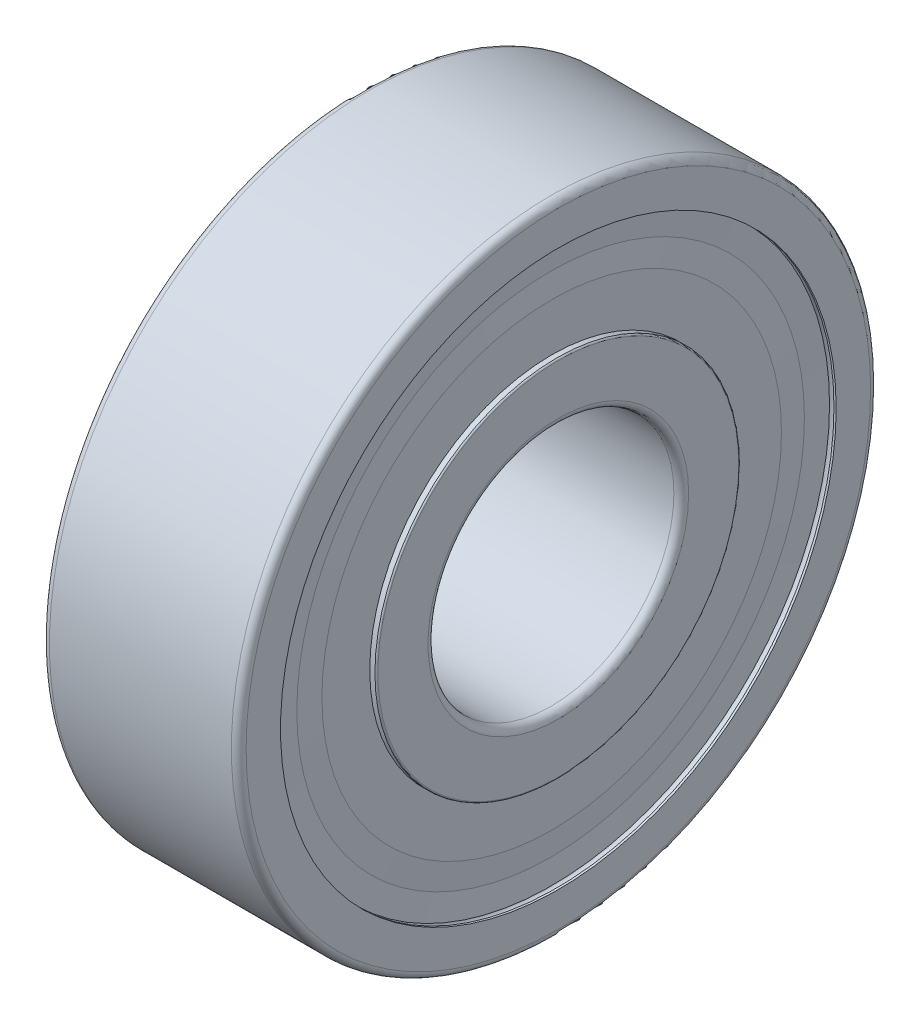
ISO-10303-21;
HEADER;
FILE_DESCRIPTION(('STEP AP214'),'2;1');
FILE_NAME('part.step','',(''),(''),'','','');
FILE_SCHEMA(('AUTOMOTIVE_DESIGN { 1 0 10303 214 1 1 1 1 }'));
ENDSEC;
DATA;
#1=APPLICATION_CONTEXT('core data for automotive mechanical design processes');
#2=APPLICATION_PROTOCOL_DEFINITION('international standard','automotive_design',2000,#1);
#3=PRODUCT_CONTEXT('',#1,'mechanical');
#4=PRODUCT('Part','Part','',(#3));
#5=PRODUCT_RELATED_PRODUCT_CATEGORY('part','',(#4));
#6=PRODUCT_DEFINITION_FORMATION('','',#4);
#7=PRODUCT_DEFINITION_CONTEXT('part definition',#1,'design');
#8=PRODUCT_DEFINITION('design','',#6,#7);
#9=PRODUCT_DEFINITION_SHAPE('','',#8);
#10=(LENGTH_UNIT() NAMED_UNIT(*) SI_UNIT(.MILLI.,.METRE.));
#11=(NAMED_UNIT(*) PLANE_ANGLE_UNIT() SI_UNIT($,.RADIAN.));
#12=(NAMED_UNIT(*) SI_UNIT($,.STERADIAN.) SOLID_ANGLE_UNIT());
#13=UNCERTAINTY_MEASURE_WITH_UNIT(LENGTH_MEASURE(1.E-05),#10,'distance_accuracy_value','');
#14=(GEOMETRIC_REPRESENTATION_CONTEXT(3) GLOBAL_UNCERTAINTY_ASSIGNED_CONTEXT((#13)) GLOBAL_UNIT_ASSIGNED_CONTEXT((#10,
#11,#12)) REPRESENTATION_CONTEXT('',''));
#15=CARTESIAN_POINT('',(0.,0.,0.));
#16=DIRECTION('',(0.,0.,1.));
#17=DIRECTION('',(1.,0.,0.));
#18=AXIS2_PLACEMENT_3D('',#15,#16,#17);
#19=CARTESIAN_POINT('',(50.,0.,0.));
#20=DIRECTION('',(-1.,0.,0.));
#21=DIRECTION('',(0.,0.,-1.));
#22=AXIS2_PLACEMENT_3D('',#19,#20,#21);
#23=CYLINDRICAL_SURFACE('',#22,11.3);
#24=CARTESIAN_POINT('',(7.64,0.,0.));
#25=DIRECTION('',(1.,0.,0.));
#26=DIRECTION('',(0.,0.,-1.));
#27=AXIS2_PLACEMENT_3D('',#24,#25,#26);
#28=CIRCLE('',#27,11.3);
#29=CARTESIAN_POINT('',(7.64,0.,-11.3));
#30=VERTEX_POINT('',#29);
#31=EDGE_CURVE('P0_E182',#30,#30,#28,.T.);
#32=ORIENTED_EDGE('',*,*,#31,.T.);
#33=EDGE_LOOP('',(#32));
#34=FACE_BOUND('',#33,.T.);
#35=CARTESIAN_POINT('',(7.73,0.,0.));
#36=DIRECTION('',(1.,0.,0.));
#37=DIRECTION('',(0.,0.,-1.));
#38=AXIS2_PLACEMENT_3D('',#35,#36,#37);
#39=CIRCLE('',#38,11.3);
#40=CARTESIAN_POINT('',(7.73,0.,-11.3));
#41=VERTEX_POINT('',#40);
#42=EDGE_CURVE('P0_E11',#41,#41,#39,.T.);
#43=ORIENTED_EDGE('',*,*,#42,.F.);
#44=EDGE_LOOP('',(#43));
#45=FACE_BOUND('',#44,.T.);
#46=ADVANCED_FACE('P0_F17',(#34,#45),#23,.T.);
#47=CARTESIAN_POINT('',(7.685,0.,0.));
#48=DIRECTION('',(1.,0.,0.));
#49=DIRECTION('',(0.,0.,-1.));
#50=AXIS2_PLACEMENT_3D('',#47,#48,#49);
#51=CONICAL_SURFACE('',#50,10.3225,1.524793001);
#52=CARTESIAN_POINT('',(7.685,0.,0.));
#53=DIRECTION('',(1.,0.,0.));
#54=DIRECTION('',(0.,0.,-1.));
#55=AXIS2_PLACEMENT_3D('',#52,#53,#54);
#56=CIRCLE('',#55,10.3225);
#57=CARTESIAN_POINT('',(7.685,0.,-10.3225));
#58=VERTEX_POINT('',#57);
#59=EDGE_CURVE('P0_E28',#58,#58,#56,.T.);
#60=ORIENTED_EDGE('',*,*,#59,.F.);
#61=EDGE_LOOP('',(#60));
#62=FACE_BOUND('',#61,.T.);
#63=ORIENTED_EDGE('',*,*,#42,.T.);
#64=EDGE_LOOP('',(#63));
#65=FACE_BOUND('',#64,.T.);
#66=ADVANCED_FACE('P0_F248',(#62,#65),#51,.F.);
#67=CARTESIAN_POINT('',(7.73,0.,0.));
#68=DIRECTION('',(-1.,0.,0.));
#69=DIRECTION('',(0.,0.,1.));
#70=AXIS2_PLACEMENT_3D('',#67,#68,#69);
#71=CONICAL_SURFACE('',#70,9.345,1.524793001);
#72=CARTESIAN_POINT('',(7.73,0.,0.));
#73=DIRECTION('',(1.,0.,0.));
#74=DIRECTION('',(0.,0.,-1.));
#75=AXIS2_PLACEMENT_3D('',#72,#73,#74);
#76=CIRCLE('',#75,9.345);
#77=CARTESIAN_POINT('',(7.73,0.,-9.345));
#78=VERTEX_POINT('',#77);
#79=EDGE_CURVE('P0_E168',#78,#78,#76,.T.);
#80=ORIENTED_EDGE('',*,*,#79,.F.);
#81=EDGE_LOOP('',(#80));
#82=FACE_BOUND('',#81,.T.);
#83=ORIENTED_EDGE('',*,*,#59,.T.);
#84=EDGE_LOOP('',(#83));
#85=FACE_BOUND('',#84,.T.);
#86=ADVANCED_FACE('P0_F19',(#82,#85),#71,.T.);
#87=CARTESIAN_POINT('',(7.73,7.39,0.));
#88=DIRECTION('',(1.,0.,0.));
#89=DIRECTION('',(0.,1.,0.));
#90=AXIS2_PLACEMENT_3D('',#87,#88,#89);
#91=PLANE('',#90);
#92=CARTESIAN_POINT('',(7.73,0.,0.));
#93=DIRECTION('',(-1.,0.,0.));
#94=DIRECTION('',(0.,0.,-1.));
#95=AXIS2_PLACEMENT_3D('',#92,#93,#94);
#96=CIRCLE('',#95,7.4);
#97=CARTESIAN_POINT('',(7.73,0.,-7.4));
#98=VERTEX_POINT('',#97);
#99=EDGE_CURVE('P0_E153',#98,#98,#96,.T.);
#100=ORIENTED_EDGE('',*,*,#99,.T.);
#101=EDGE_LOOP('',(#100));
#102=FACE_BOUND('',#101,.T.);
#103=ORIENTED_EDGE('',*,*,#79,.T.);
#104=EDGE_LOOP('',(#103));
#105=FACE_BOUND('',#104,.T.);
#106=ADVANCED_FACE('P0_F328',(#102,#105),#91,.T.);
#107=CARTESIAN_POINT('',(7.55,0.,0.));
#108=DIRECTION('',(-1.,0.,0.));
#109=DIRECTION('',(0.,0.,1.));
#110=AXIS2_PLACEMENT_3D('',#107,#108,#109);
#111=CONICAL_SURFACE('',#110,9.345,1.524793001);
#112=CARTESIAN_POINT('',(7.63953964194373,0.,0.));
#113=DIRECTION('',(1.,0.,0.));
#114=DIRECTION('',(0.,0.,1.));
#115=AXIS2_PLACEMENT_3D('',#112,#113,#114);
#116=CIRCLE('',#115,7.4);
#117=CARTESIAN_POINT('',(7.63953964194373,0.,7.4));
#118=VERTEX_POINT('',#117);
#119=EDGE_CURVE('P0_E106',#118,#118,#116,.T.);
#120=ORIENTED_EDGE('',*,*,#119,.T.);
#121=EDGE_LOOP('',(#120));
#122=FACE_BOUND('',#121,.T.);
#123=CARTESIAN_POINT('',(7.55,0.,0.));
#124=DIRECTION('',(1.,0.,0.));
#125=DIRECTION('',(0.,0.,-1.));
#126=AXIS2_PLACEMENT_3D('',#123,#124,#125);
#127=CIRCLE('',#126,9.345);
#128=CARTESIAN_POINT('',(7.55,0.,-9.345));
#129=VERTEX_POINT('',#128);
#130=EDGE_CURVE('P0_E172',#129,#129,#127,.T.);
#131=ORIENTED_EDGE('',*,*,#130,.F.);
#132=EDGE_LOOP('',(#131));
#133=FACE_BOUND('',#132,.T.);
#134=ADVANCED_FACE('P0_F319',(#122,#133),#111,.F.);
#135=CARTESIAN_POINT('',(50.,0.,0.));
#136=DIRECTION('',(-1.,0.,0.));
#137=DIRECTION('',(0.,0.,-1.));
#138=AXIS2_PLACEMENT_3D('',#135,#136,#137);
#139=CYLINDRICAL_SURFACE('',#138,7.4);
#140=CARTESIAN_POINT('',(0.360460358056265,0.,0.));
#141=DIRECTION('',(-1.,0.,0.));
#142=DIRECTION('',(0.,0.,-1.));
#143=AXIS2_PLACEMENT_3D('',#140,#141,#142);
#144=CIRCLE('',#143,7.4);
#145=CARTESIAN_POINT('',(0.360460358056265,0.,-7.4));
#146=VERTEX_POINT('',#145);
#147=EDGE_CURVE('P0_E171',#146,#146,#144,.T.);
#148=ORIENTED_EDGE('',*,*,#147,.F.);
#149=EDGE_LOOP('',(#148));
#150=FACE_BOUND('',#149,.T.);
#151=CARTESIAN_POINT('',(2.15090265264373,0.,0.));
#152=DIRECTION('',(1.,0.,0.));
#153=DIRECTION('',(0.,0.,-1.));
#154=AXIS2_PLACEMENT_3D('',#151,#152,#153);
#155=CIRCLE('',#154,7.4);
#156=CARTESIAN_POINT('',(2.15090265264373,0.,-7.4));
#157=VERTEX_POINT('',#156);
#158=EDGE_CURVE('P0_E190',#157,#157,#155,.T.);
#159=ORIENTED_EDGE('',*,*,#158,.F.);
#160=EDGE_LOOP('',(#159));
#161=FACE_BOUND('',#160,.T.);
#162=ADVANCED_FACE('P0_F263',(#150,#161),#139,.T.);
#163=CARTESIAN_POINT('',(0.36,0.,0.));
#164=DIRECTION('',(1.,0.,0.));
#165=DIRECTION('',(0.,0.,-1.));
#166=AXIS2_PLACEMENT_3D('',#163,#164,#165);
#167=CONICAL_SURFACE('',#166,7.39,1.524793001);
#168=ORIENTED_EDGE('',*,*,#147,.T.);
#169=EDGE_LOOP('',(#168));
#170=FACE_BOUND('',#169,.T.);
#171=CARTESIAN_POINT('',(0.45,0.,0.));
#172=DIRECTION('',(1.,0.,0.));
#173=DIRECTION('',(0.,0.,-1.));
#174=AXIS2_PLACEMENT_3D('',#171,#172,#173);
#175=CIRCLE('',#174,9.345);
#176=CARTESIAN_POINT('',(0.45,0.,-9.345));
#177=VERTEX_POINT('',#176);
#178=EDGE_CURVE('P0_E203',#177,#177,#175,.T.);
#179=ORIENTED_EDGE('',*,*,#178,.T.);
#180=EDGE_LOOP('',(#179));
#181=FACE_BOUND('',#180,.T.);
#182=ADVANCED_FACE('P0_F259',(#170,#181),#167,.F.);
#183=CARTESIAN_POINT('',(0.45,9.345,0.));
#184=DIRECTION('',(1.,0.,0.));
#185=DIRECTION('',(0.,1.,0.));
#186=AXIS2_PLACEMENT_3D('',#183,#184,#185);
#187=PLANE('',#186);
#188=ORIENTED_EDGE('',*,*,#178,.F.);
#189=EDGE_LOOP('',(#188));
#190=FACE_BOUND('',#189,.T.);
#191=CARTESIAN_POINT('',(0.45,0.,0.));
#192=DIRECTION('',(1.,0.,0.));
#193=DIRECTION('',(0.,0.,-1.));
#194=AXIS2_PLACEMENT_3D('',#191,#192,#193);
#195=CIRCLE('',#194,10.3225);
#196=CARTESIAN_POINT('',(0.45,0.,-10.3225));
#197=VERTEX_POINT('',#196);
#198=EDGE_CURVE('P0_E114',#197,#197,#195,.T.);
#199=ORIENTED_EDGE('',*,*,#198,.T.);
#200=EDGE_LOOP('',(#199));
#201=FACE_BOUND('',#200,.T.);
#202=ADVANCED_FACE('P0_F262',(#190,#201),#187,.T.);
#203=CARTESIAN_POINT('',(50.,0.,0.));
#204=DIRECTION('',(-1.,0.,0.));
#205=DIRECTION('',(0.,0.,-1.));
#206=AXIS2_PLACEMENT_3D('',#203,#204,#205);
#207=CYLINDRICAL_SURFACE('',#206,11.3);
#208=CARTESIAN_POINT('',(0.27,0.,0.));
#209=DIRECTION('',(1.,0.,0.));
#210=DIRECTION('',(0.,0.,-1.));
#211=AXIS2_PLACEMENT_3D('',#208,#209,#210);
#212=CIRCLE('',#211,11.3);
#213=CARTESIAN_POINT('',(0.27,0.,-11.3));
#214=VERTEX_POINT('',#213);
#215=EDGE_CURVE('P0_E185',#214,#214,#212,.T.);
#216=ORIENTED_EDGE('',*,*,#215,.T.);
#217=EDGE_LOOP('',(#216));
#218=FACE_BOUND('',#217,.T.);
#219=CARTESIAN_POINT('',(0.36,0.,0.));
#220=DIRECTION('',(1.,0.,0.));
#221=DIRECTION('',(0.,0.,-1.));
#222=AXIS2_PLACEMENT_3D('',#219,#220,#221);
#223=CIRCLE('',#222,11.3);
#224=CARTESIAN_POINT('',(0.36,0.,-11.3));
#225=VERTEX_POINT('',#224);
#226=EDGE_CURVE('P0_E175',#225,#225,#223,.T.);
#227=ORIENTED_EDGE('',*,*,#226,.F.);
#228=EDGE_LOOP('',(#227));
#229=FACE_BOUND('',#228,.T.);
#230=ADVANCED_FACE('P0_F285',(#218,#229),#207,.T.);
#231=CARTESIAN_POINT('',(0.27,0.,0.));
#232=DIRECTION('',(-1.,0.,0.));
#233=DIRECTION('',(0.,0.,1.));
#234=AXIS2_PLACEMENT_3D('',#231,#232,#233);
#235=CONICAL_SURFACE('',#234,11.3,1.524793001);
#236=CARTESIAN_POINT('',(0.315,0.,0.));
#237=DIRECTION('',(1.,0.,0.));
#238=DIRECTION('',(0.,0.,-1.));
#239=AXIS2_PLACEMENT_3D('',#236,#237,#238);
#240=CIRCLE('',#239,10.3225);
#241=CARTESIAN_POINT('',(0.315,0.,-10.3225));
#242=VERTEX_POINT('',#241);
#243=EDGE_CURVE('P0_E167',#242,#242,#240,.T.);
#244=ORIENTED_EDGE('',*,*,#243,.T.);
#245=EDGE_LOOP('',(#244));
#246=FACE_BOUND('',#245,.T.);
#247=ORIENTED_EDGE('',*,*,#215,.F.);
#248=EDGE_LOOP('',(#247));
#249=FACE_BOUND('',#248,.T.);
#250=ADVANCED_FACE('P0_F287',(#246,#249),#235,.F.);
#251=CARTESIAN_POINT('',(0.315,0.,0.));
#252=DIRECTION('',(1.,0.,0.));
#253=DIRECTION('',(0.,0.,-1.));
#254=AXIS2_PLACEMENT_3D('',#251,#252,#253);
#255=CONICAL_SURFACE('',#254,10.3225,1.524793001);
#256=CARTESIAN_POINT('',(0.27,0.,0.));
#257=DIRECTION('',(1.,0.,0.));
#258=DIRECTION('',(0.,0.,-1.));
#259=AXIS2_PLACEMENT_3D('',#256,#257,#258);
#260=CIRCLE('',#259,9.345);
#261=CARTESIAN_POINT('',(0.27,0.,-9.345));
#262=VERTEX_POINT('',#261);
#263=EDGE_CURVE('P0_E163',#262,#262,#260,.T.);
#264=ORIENTED_EDGE('',*,*,#263,.T.);
#265=EDGE_LOOP('',(#264));
#266=FACE_BOUND('',#265,.T.);
#267=ORIENTED_EDGE('',*,*,#243,.F.);
#268=EDGE_LOOP('',(#267));
#269=FACE_BOUND('',#268,.T.);
#270=ADVANCED_FACE('P0_F294',(#266,#269),#255,.T.);
#271=CARTESIAN_POINT('',(0.27,9.345,0.));
#272=DIRECTION('',(-1.,0.,0.));
#273=DIRECTION('',(0.,0.,1.));
#274=AXIS2_PLACEMENT_3D('',#271,#272,#273);
#275=PLANE('',#274);
#276=CARTESIAN_POINT('',(0.27,0.,0.));
#277=DIRECTION('',(1.,0.,0.));
#278=DIRECTION('',(0.,0.,1.));
#279=AXIS2_PLACEMENT_3D('',#276,#277,#278);
#280=CIRCLE('',#279,7.4);
#281=CARTESIAN_POINT('',(0.27,0.,7.4));
#282=VERTEX_POINT('',#281);
#283=EDGE_CURVE('P0_E21',#282,#282,#280,.T.);
#284=ORIENTED_EDGE('',*,*,#283,.T.);
#285=EDGE_LOOP('',(#284));
#286=FACE_BOUND('',#285,.T.);
#287=ORIENTED_EDGE('',*,*,#263,.F.);
#288=EDGE_LOOP('',(#287));
#289=FACE_BOUND('',#288,.T.);
#290=ADVANCED_FACE('P0_F326',(#286,#289),#275,.T.);
#291=CARTESIAN_POINT('',(0.0599999999999989,0.,0.));
#292=DIRECTION('',(1.,0.,0.));
#293=DIRECTION('',(0.,0.,-1.));
#294=AXIS2_PLACEMENT_3D('',#291,#292,#293);
#295=TOROIDAL_SURFACE('',#294,7.34,0.06);
#296=CARTESIAN_POINT('',(0.,0.,0.));
#297=DIRECTION('',(1.,0.,0.));
#298=DIRECTION('',(0.,0.,-1.));
#299=AXIS2_PLACEMENT_3D('',#296,#297,#298);
#300=CIRCLE('',#299,7.34);
#301=CARTESIAN_POINT('',(0.,0.,-7.34));
#302=VERTEX_POINT('',#301);
#303=EDGE_CURVE('P0_E160',#302,#302,#300,.T.);
#304=ORIENTED_EDGE('',*,*,#303,.T.);
#305=EDGE_LOOP('',(#304));
#306=FACE_BOUND('',#305,.T.);
#307=CARTESIAN_POINT('',(0.0599999999999976,0.,0.));
#308=DIRECTION('',(1.,0.,0.));
#309=DIRECTION('',(0.,0.,-1.));
#310=AXIS2_PLACEMENT_3D('',#307,#308,#309);
#311=CIRCLE('',#310,7.4);
#312=CARTESIAN_POINT('',(0.0599999999999976,0.,-7.4));
#313=VERTEX_POINT('',#312);
#314=EDGE_CURVE('P0_E143',#313,#313,#311,.T.);
#315=ORIENTED_EDGE('',*,*,#314,.F.);
#316=EDGE_LOOP('',(#315));
#317=FACE_BOUND('',#316,.T.);
#318=ADVANCED_FACE('P0_F307',(#306,#317),#295,.T.);
#319=CARTESIAN_POINT('',(0.,7.34,0.));
#320=DIRECTION('',(-1.,0.,0.));
#321=DIRECTION('',(0.,0.,1.));
#322=AXIS2_PLACEMENT_3D('',#319,#320,#321);
#323=PLANE('',#322);
#324=CARTESIAN_POINT('',(0.,0.,0.));
#325=DIRECTION('',(1.,0.,0.));
#326=DIRECTION('',(0.,0.,-1.));
#327=AXIS2_PLACEMENT_3D('',#324,#325,#326);
#328=CIRCLE('',#327,5.3);
#329=CARTESIAN_POINT('',(0.,0.,-5.3));
#330=VERTEX_POINT('',#329);
#331=EDGE_CURVE('P0_E164',#330,#330,#328,.T.);
#332=ORIENTED_EDGE('',*,*,#331,.T.);
#333=EDGE_LOOP('',(#332));
#334=FACE_BOUND('',#333,.T.);
#335=ORIENTED_EDGE('',*,*,#303,.F.);
#336=EDGE_LOOP('',(#335));
#337=FACE_BOUND('',#336,.T.);
#338=ADVANCED_FACE('P0_F244',(#334,#337),#323,.T.);
#339=CARTESIAN_POINT('',(0.3,0.,0.));
#340=DIRECTION('',(1.,0.,0.));
#341=DIRECTION('',(0.,0.,-1.));
#342=AXIS2_PLACEMENT_3D('',#339,#340,#341);
#343=TOROIDAL_SURFACE('',#342,5.3,0.3);
#344=CARTESIAN_POINT('',(0.3,0.,0.));
#345=DIRECTION('',(1.,0.,0.));
#346=DIRECTION('',(0.,0.,-1.));
#347=AXIS2_PLACEMENT_3D('',#344,#345,#346);
#348=CIRCLE('',#347,5.);
#349=CARTESIAN_POINT('',(0.3,0.,-5.));
#350=VERTEX_POINT('',#349);
#351=EDGE_CURVE('P0_E179',#350,#350,#348,.T.);
#352=ORIENTED_EDGE('',*,*,#351,.T.);
#353=EDGE_LOOP('',(#352));
#354=FACE_BOUND('',#353,.T.);
#355=ORIENTED_EDGE('',*,*,#331,.F.);
#356=EDGE_LOOP('',(#355));
#357=FACE_BOUND('',#356,.T.);
#358=ADVANCED_FACE('P0_F227',(#354,#357),#343,.T.);
#359=CARTESIAN_POINT('',(50.,0.,0.));
#360=DIRECTION('',(-1.,0.,0.));
#361=DIRECTION('',(0.,0.,-1.));
#362=AXIS2_PLACEMENT_3D('',#359,#360,#361);
#363=CYLINDRICAL_SURFACE('',#362,5.);
#364=CARTESIAN_POINT('',(7.7,0.,0.));
#365=DIRECTION('',(1.,0.,0.));
#366=DIRECTION('',(0.,0.,-1.));
#367=AXIS2_PLACEMENT_3D('',#364,#365,#366);
#368=CIRCLE('',#367,5.);
#369=CARTESIAN_POINT('',(7.7,0.,-5.));
#370=VERTEX_POINT('',#369);
#371=EDGE_CURVE('P0_E196',#370,#370,#368,.T.);
#372=ORIENTED_EDGE('',*,*,#371,.T.);
#373=EDGE_LOOP('',(#372));
#374=FACE_BOUND('',#373,.T.);
#375=ORIENTED_EDGE('',*,*,#351,.F.);
#376=EDGE_LOOP('',(#375));
#377=FACE_BOUND('',#376,.T.);
#378=ADVANCED_FACE('P0_F230',(#374,#377),#363,.F.);
#379=CARTESIAN_POINT('',(7.7,0.,0.));
#380=DIRECTION('',(1.,0.,0.));
#381=DIRECTION('',(0.,0.,-1.));
#382=AXIS2_PLACEMENT_3D('',#379,#380,#381);
#383=TOROIDAL_SURFACE('',#382,5.3,0.3);
#384=CARTESIAN_POINT('',(8.,0.,0.));
#385=DIRECTION('',(1.,0.,0.));
#386=DIRECTION('',(0.,0.,-1.));
#387=AXIS2_PLACEMENT_3D('',#384,#385,#386);
#388=CIRCLE('',#387,5.3);
#389=CARTESIAN_POINT('',(8.,0.,-5.3));
#390=VERTEX_POINT('',#389);
#391=EDGE_CURVE('P0_E199',#390,#390,#388,.T.);
#392=ORIENTED_EDGE('',*,*,#391,.T.);
#393=EDGE_LOOP('',(#392));
#394=FACE_BOUND('',#393,.T.);
#395=ORIENTED_EDGE('',*,*,#371,.F.);
#396=EDGE_LOOP('',(#395));
#397=FACE_BOUND('',#396,.T.);
#398=ADVANCED_FACE('P0_F232',(#394,#397),#383,.T.);
#399=CARTESIAN_POINT('',(8.,5.3,0.));
#400=DIRECTION('',(1.,0.,0.));
#401=DIRECTION('',(0.,1.,0.));
#402=AXIS2_PLACEMENT_3D('',#399,#400,#401);
#403=PLANE('',#402);
#404=ORIENTED_EDGE('',*,*,#391,.F.);
#405=EDGE_LOOP('',(#404));
#406=FACE_BOUND('',#405,.T.);
#407=CARTESIAN_POINT('',(8.,0.,0.));
#408=DIRECTION('',(1.,0.,0.));
#409=DIRECTION('',(0.,0.,-1.));
#410=AXIS2_PLACEMENT_3D('',#407,#408,#409);
#411=CIRCLE('',#410,7.34);
#412=CARTESIAN_POINT('',(8.,0.,-7.34));
#413=VERTEX_POINT('',#412);
#414=EDGE_CURVE('P0_E193',#413,#413,#411,.T.);
#415=ORIENTED_EDGE('',*,*,#414,.T.);
#416=EDGE_LOOP('',(#415));
#417=FACE_BOUND('',#416,.T.);
#418=ADVANCED_FACE('P0_F241',(#406,#417),#403,.T.);
#419=CARTESIAN_POINT('',(7.94,0.,0.));
#420=DIRECTION('',(1.,0.,0.));
#421=DIRECTION('',(0.,0.,-1.));
#422=AXIS2_PLACEMENT_3D('',#419,#420,#421);
#423=TOROIDAL_SURFACE('',#422,7.34,0.06);
#424=CARTESIAN_POINT('',(7.94,0.,0.));
#425=DIRECTION('',(1.,0.,0.));
#426=DIRECTION('',(0.,0.,-1.));
#427=AXIS2_PLACEMENT_3D('',#424,#425,#426);
#428=CIRCLE('',#427,7.4);
#429=CARTESIAN_POINT('',(7.94,0.,-7.4));
#430=VERTEX_POINT('',#429);
#431=EDGE_CURVE('P0_E148',#430,#430,#428,.T.);
#432=ORIENTED_EDGE('',*,*,#431,.T.);
#433=EDGE_LOOP('',(#432));
#434=FACE_BOUND('',#433,.T.);
#435=ORIENTED_EDGE('',*,*,#414,.F.);
#436=EDGE_LOOP('',(#435));
#437=FACE_BOUND('',#436,.T.);
#438=ADVANCED_FACE('P0_F301',(#434,#437),#423,.T.);
#439=CARTESIAN_POINT('',(4.,0.,0.));
#440=DIRECTION('',(1.,0.,0.));
#441=DIRECTION('',(0.,0.,-1.));
#442=AXIS2_PLACEMENT_3D('',#439,#440,#441);
#443=TOROIDAL_SURFACE('',#442,8.9,2.381);
#444=CARTESIAN_POINT('',(5.84909734735627,0.,0.));
#445=DIRECTION('',(1.,0.,0.));
#446=DIRECTION('',(0.,0.,-1.));
#447=AXIS2_PLACEMENT_3D('',#444,#445,#446);
#448=CIRCLE('',#447,7.4);
#449=CARTESIAN_POINT('',(5.84909734735627,0.,-7.4));
#450=VERTEX_POINT('',#449);
#451=EDGE_CURVE('P0_E156',#450,#450,#448,.T.);
#452=ORIENTED_EDGE('',*,*,#451,.F.);
#453=EDGE_LOOP('',(#452));
#454=FACE_BOUND('',#453,.T.);
#455=ORIENTED_EDGE('',*,*,#158,.T.);
#456=EDGE_LOOP('',(#455));
#457=FACE_BOUND('',#456,.T.);
#458=ADVANCED_FACE('P0_F304',(#454,#457),#443,.F.);
#459=CARTESIAN_POINT('',(50.,0.,0.));
#460=DIRECTION('',(-1.,0.,0.));
#461=DIRECTION('',(0.,0.,-1.));
#462=AXIS2_PLACEMENT_3D('',#459,#460,#461);
#463=CYLINDRICAL_SURFACE('',#462,7.4);
#464=ORIENTED_EDGE('',*,*,#99,.F.);
#465=EDGE_LOOP('',(#464));
#466=FACE_BOUND('',#465,.T.);
#467=ORIENTED_EDGE('',*,*,#431,.F.);
#468=EDGE_LOOP('',(#467));
#469=FACE_BOUND('',#468,.T.);
#470=ADVANCED_FACE('P0_F310',(#466,#469),#463,.T.);
#471=CARTESIAN_POINT('',(50.,0.,0.));
#472=DIRECTION('',(-1.,0.,0.));
#473=DIRECTION('',(0.,0.,-1.));
#474=AXIS2_PLACEMENT_3D('',#471,#472,#473);
#475=CYLINDRICAL_SURFACE('',#474,7.4);
#476=ORIENTED_EDGE('',*,*,#314,.T.);
#477=EDGE_LOOP('',(#476));
#478=FACE_BOUND('',#477,.T.);
#479=ORIENTED_EDGE('',*,*,#283,.F.);
#480=EDGE_LOOP('',(#479));
#481=FACE_BOUND('',#480,.T.);
#482=ADVANCED_FACE('P0_F144',(#478,#481),#475,.T.);
#483=CARTESIAN_POINT('',(50.,0.,0.));
#484=DIRECTION('',(-1.,0.,0.));
#485=DIRECTION('',(0.,0.,-1.));
#486=AXIS2_PLACEMENT_3D('',#483,#484,#485);
#487=CYLINDRICAL_SURFACE('',#486,7.4);
#488=ORIENTED_EDGE('',*,*,#451,.T.);
#489=EDGE_LOOP('',(#488));
#490=FACE_BOUND('',#489,.T.);
#491=ORIENTED_EDGE('',*,*,#119,.F.);
#492=EDGE_LOOP('',(#491));
#493=FACE_BOUND('',#492,.T.);
#494=ADVANCED_FACE('P0_F271',(#490,#493),#487,.T.);
#495=CARTESIAN_POINT('',(0.45,0.,0.));
#496=DIRECTION('',(-1.,0.,0.));
#497=DIRECTION('',(0.,0.,1.));
#498=AXIS2_PLACEMENT_3D('',#495,#496,#497);
#499=CONICAL_SURFACE('',#498,10.3225,1.4789835695);
#500=ORIENTED_EDGE('',*,*,#198,.F.);
#501=EDGE_LOOP('',(#500));
#502=FACE_BOUND('',#501,.T.);
#503=ORIENTED_EDGE('',*,*,#226,.T.);
#504=EDGE_LOOP('',(#503));
#505=FACE_BOUND('',#504,.T.);
#506=ADVANCED_FACE('P0_F269',(#502,#505),#499,.T.);
#507=CARTESIAN_POINT('',(7.55,10.3225,0.));
#508=DIRECTION('',(-1.,0.,0.));
#509=DIRECTION('',(0.,0.,1.));
#510=AXIS2_PLACEMENT_3D('',#507,#508,#509);
#511=PLANE('',#510);
#512=ORIENTED_EDGE('',*,*,#130,.T.);
#513=EDGE_LOOP('',(#512));
#514=FACE_BOUND('',#513,.T.);
#515=CARTESIAN_POINT('',(7.55,0.,0.));
#516=DIRECTION('',(1.,0.,0.));
#517=DIRECTION('',(0.,0.,-1.));
#518=AXIS2_PLACEMENT_3D('',#515,#516,#517);
#519=CIRCLE('',#518,10.3225);
#520=CARTESIAN_POINT('',(7.55,0.,-10.3225));
#521=VERTEX_POINT('',#520);
#522=EDGE_CURVE('P0_E176',#521,#521,#519,.T.);
#523=ORIENTED_EDGE('',*,*,#522,.F.);
#524=EDGE_LOOP('',(#523));
#525=FACE_BOUND('',#524,.T.);
#526=ADVANCED_FACE('P0_F267',(#514,#525),#511,.T.);
#527=CARTESIAN_POINT('',(7.64,0.,0.));
#528=DIRECTION('',(1.,0.,0.));
#529=DIRECTION('',(0.,0.,-1.));
#530=AXIS2_PLACEMENT_3D('',#527,#528,#529);
#531=CONICAL_SURFACE('',#530,11.3,1.4789835695);
#532=ORIENTED_EDGE('',*,*,#522,.T.);
#533=EDGE_LOOP('',(#532));
#534=FACE_BOUND('',#533,.T.);
#535=ORIENTED_EDGE('',*,*,#31,.F.);
#536=EDGE_LOOP('',(#535));
#537=FACE_BOUND('',#536,.T.);
#538=ADVANCED_FACE('P0_F265',(#534,#537),#531,.T.);
#539=CLOSED_SHELL('',(#46,#66,#86,#106,#134,#162,#182,#202,#230,#250,#270,#290,#318,#338,#358,
#378,#398,#418,#438,#458,#470,#482,#494,#506,#526,#538));
#540=MANIFOLD_SOLID_BREP('P0_B1',#539);
#541=CARTESIAN_POINT('',(50.,0.,0.));
#542=DIRECTION('',(-1.,0.,0.));
#543=DIRECTION('',(0.,0.,-1.));
#544=AXIS2_PLACEMENT_3D('',#541,#542,#543);
#545=CYLINDRICAL_SURFACE('',#544,13.);
#546=CARTESIAN_POINT('',(0.3,0.,0.));
#547=DIRECTION('',(1.,0.,0.));
#548=DIRECTION('',(0.,0.,-1.));
#549=AXIS2_PLACEMENT_3D('',#546,#547,#548);
#550=CIRCLE('',#549,13.);
#551=CARTESIAN_POINT('',(0.3,0.,-13.));
#552=VERTEX_POINT('',#551);
#553=EDGE_CURVE('P1_E109',#552,#552,#550,.T.);
#554=ORIENTED_EDGE('',*,*,#553,.T.);
#555=EDGE_LOOP('',(#554));
#556=FACE_BOUND('',#555,.T.);
#557=CARTESIAN_POINT('',(7.7,0.,0.));
#558=DIRECTION('',(1.,0.,0.));
#559=DIRECTION('',(0.,0.,-1.));
#560=AXIS2_PLACEMENT_3D('',#557,#558,#559);
#561=CIRCLE('',#560,13.);
#562=CARTESIAN_POINT('',(7.7,0.,-13.));
#563=VERTEX_POINT('',#562);
#564=EDGE_CURVE('P1_E11',#563,#563,#561,.T.);
#565=ORIENTED_EDGE('',*,*,#564,.F.);
#566=EDGE_LOOP('',(#565));
#567=FACE_BOUND('',#566,.T.);
#568=ADVANCED_FACE('P1_F17',(#556,#567),#545,.T.);
#569=CARTESIAN_POINT('',(7.7,0.,0.));
#570=DIRECTION('',(1.,0.,0.));
#571=DIRECTION('',(0.,0.,-1.));
#572=AXIS2_PLACEMENT_3D('',#569,#570,#571);
#573=TOROIDAL_SURFACE('',#572,12.7,0.3);
#574=ORIENTED_EDGE('',*,*,#564,.T.);
#575=EDGE_LOOP('',(#574));
#576=FACE_BOUND('',#575,.T.);
#577=CARTESIAN_POINT('',(8.,0.,0.));
#578=DIRECTION('',(1.,0.,0.));
#579=DIRECTION('',(0.,0.,-1.));
#580=AXIS2_PLACEMENT_3D('',#577,#578,#579);
#581=CIRCLE('',#580,12.7);
#582=CARTESIAN_POINT('',(8.,0.,-12.7));
#583=VERTEX_POINT('',#582);
#584=EDGE_CURVE('P1_E28',#583,#583,#581,.T.);
#585=ORIENTED_EDGE('',*,*,#584,.F.);
#586=EDGE_LOOP('',(#585));
#587=FACE_BOUND('',#586,.T.);
#588=ADVANCED_FACE('P1_F140',(#576,#587),#573,.T.);
#589=CARTESIAN_POINT('',(8.,11.3,0.));
#590=DIRECTION('',(1.,0.,0.));
#591=DIRECTION('',(0.,1.,0.));
#592=AXIS2_PLACEMENT_3D('',#589,#590,#591);
#593=PLANE('',#592);
#594=CARTESIAN_POINT('',(8.,0.,0.));
#595=DIRECTION('',(1.,0.,0.));
#596=DIRECTION('',(0.,0.,-1.));
#597=AXIS2_PLACEMENT_3D('',#594,#595,#596);
#598=CIRCLE('',#597,11.3);
#599=CARTESIAN_POINT('',(8.,0.,-11.3));
#600=VERTEX_POINT('',#599);
#601=EDGE_CURVE('P1_E113',#600,#600,#598,.T.);
#602=ORIENTED_EDGE('',*,*,#601,.F.);
#603=EDGE_LOOP('',(#602));
#604=FACE_BOUND('',#603,.T.);
#605=ORIENTED_EDGE('',*,*,#584,.T.);
#606=EDGE_LOOP('',(#605));
#607=FACE_BOUND('',#606,.T.);
#608=ADVANCED_FACE('P1_F147',(#604,#607),#593,.T.);
#609=CARTESIAN_POINT('',(50.,0.,0.));
#610=DIRECTION('',(-1.,0.,0.));
#611=DIRECTION('',(0.,0.,-1.));
#612=AXIS2_PLACEMENT_3D('',#609,#610,#611);
#613=CYLINDRICAL_SURFACE('',#612,11.3);
#614=ORIENTED_EDGE('',*,*,#601,.T.);
#615=EDGE_LOOP('',(#614));
#616=FACE_BOUND('',#615,.T.);
#617=CARTESIAN_POINT('',(7.91,0.,0.));
#618=DIRECTION('',(1.,0.,0.));
#619=DIRECTION('',(0.,0.,-1.));
#620=AXIS2_PLACEMENT_3D('',#617,#618,#619);
#621=CIRCLE('',#620,11.3);
#622=CARTESIAN_POINT('',(7.91,0.,-11.3));
#623=VERTEX_POINT('',#622);
#624=EDGE_CURVE('P1_E21',#623,#623,#621,.T.);
#625=ORIENTED_EDGE('',*,*,#624,.F.);
#626=EDGE_LOOP('',(#625));
#627=FACE_BOUND('',#626,.T.);
#628=ADVANCED_FACE('P1_F160',(#616,#627),#613,.F.);
#629=CARTESIAN_POINT('',(7.73,0.,0.));
#630=DIRECTION('',(1.,0.,0.));
#631=DIRECTION('',(0.,0.,-1.));
#632=AXIS2_PLACEMENT_3D('',#629,#630,#631);
#633=TOROIDAL_SURFACE('',#632,11.3,0.18);
#634=CARTESIAN_POINT('',(7.73,0.,-11.48));
#635=VERTEX_POINT('',#634);
#636=VERTEX_LOOP('',#635);
#637=FACE_BOUND('',#636,.T.);
#638=CARTESIAN_POINT('',(7.55,0.,0.));
#639=DIRECTION('',(1.,0.,0.));
#640=DIRECTION('',(0.,0.,-1.));
#641=AXIS2_PLACEMENT_3D('',#638,#639,#640);
#642=CIRCLE('',#641,11.3);
#643=CARTESIAN_POINT('',(7.55,0.,-11.3));
#644=VERTEX_POINT('',#643);
#645=EDGE_CURVE('P1_E93',#644,#644,#642,.T.);
#646=ORIENTED_EDGE('',*,*,#645,.F.);
#647=EDGE_LOOP('',(#646));
#648=FACE_BOUND('',#647,.T.);
#649=ORIENTED_EDGE('',*,*,#624,.T.);
#650=EDGE_LOOP('',(#649));
#651=FACE_BOUND('',#650,.T.);
#652=ADVANCED_FACE('P1_F156',(#637,#648,#651),#633,.F.);
#653=CARTESIAN_POINT('',(7.42657111350407,0.,0.));
#654=DIRECTION('',(1.,0.,0.));
#655=DIRECTION('',(0.,0.,-1.));
#656=AXIS2_PLACEMENT_3D('',#653,#654,#655);
#657=CONICAL_SURFACE('',#656,10.6,1.3962634016);
#658=CARTESIAN_POINT('',(7.42657111350407,0.,0.));
#659=DIRECTION('',(1.,0.,0.));
#660=DIRECTION('',(0.,0.,-1.));
#661=AXIS2_PLACEMENT_3D('',#658,#659,#660);
#662=CIRCLE('',#661,10.6);
#663=CARTESIAN_POINT('',(7.42657111350407,0.,-10.6));
#664=VERTEX_POINT('',#663);
#665=EDGE_CURVE('P1_E86',#664,#664,#662,.T.);
#666=ORIENTED_EDGE('',*,*,#665,.F.);
#667=EDGE_LOOP('',(#666));
#668=FACE_BOUND('',#667,.T.);
#669=ORIENTED_EDGE('',*,*,#645,.T.);
#670=EDGE_LOOP('',(#669));
#671=FACE_BOUND('',#670,.T.);
#672=ADVANCED_FACE('P1_F159',(#668,#671),#657,.F.);
#673=CARTESIAN_POINT('',(50.,0.,0.));
#674=DIRECTION('',(-1.,0.,0.));
#675=DIRECTION('',(0.,0.,-1.));
#676=AXIS2_PLACEMENT_3D('',#673,#674,#675);
#677=CYLINDRICAL_SURFACE('',#676,10.6);
#678=ORIENTED_EDGE('',*,*,#665,.T.);
#679=EDGE_LOOP('',(#678));
#680=FACE_BOUND('',#679,.T.);
#681=CARTESIAN_POINT('',(5.667081581687,0.,0.));
#682=DIRECTION('',(1.,0.,0.));
#683=DIRECTION('',(0.,0.,-1.));
#684=AXIS2_PLACEMENT_3D('',#681,#682,#683);
#685=CIRCLE('',#684,10.6);
#686=CARTESIAN_POINT('',(5.667081581687,0.,-10.6));
#687=VERTEX_POINT('',#686);
#688=EDGE_CURVE('P1_E82',#687,#687,#685,.T.);
#689=ORIENTED_EDGE('',*,*,#688,.F.);
#690=EDGE_LOOP('',(#689));
#691=FACE_BOUND('',#690,.T.);
#692=ADVANCED_FACE('P1_F135',(#680,#691),#677,.F.);
#693=CARTESIAN_POINT('',(4.,0.,0.));
#694=DIRECTION('',(1.,0.,0.));
#695=DIRECTION('',(0.,0.,-1.));
#696=AXIS2_PLACEMENT_3D('',#693,#694,#695);
#697=TOROIDAL_SURFACE('',#696,8.9,2.381);
#698=CARTESIAN_POINT('',(4.,0.,-11.281));
#699=VERTEX_POINT('',#698);
#700=VERTEX_LOOP('',#699);
#701=FACE_BOUND('',#700,.T.);
#702=CARTESIAN_POINT('',(2.33291841831301,0.,0.));
#703=DIRECTION('',(1.,0.,0.));
#704=DIRECTION('',(0.,0.,-1.));
#705=AXIS2_PLACEMENT_3D('',#702,#703,#704);
#706=CIRCLE('',#705,10.6);
#707=CARTESIAN_POINT('',(2.33291841831301,0.,-10.6));
#708=VERTEX_POINT('',#707);
#709=EDGE_CURVE('P1_E87',#708,#708,#706,.T.);
#710=ORIENTED_EDGE('',*,*,#709,.F.);
#711=EDGE_LOOP('',(#710));
#712=FACE_BOUND('',#711,.T.);
#713=ORIENTED_EDGE('',*,*,#688,.T.);
#714=EDGE_LOOP('',(#713));
#715=FACE_BOUND('',#714,.T.);
#716=ADVANCED_FACE('P1_F83',(#701,#712,#715),#697,.F.);
#717=CARTESIAN_POINT('',(50.,0.,0.));
#718=DIRECTION('',(-1.,0.,0.));
#719=DIRECTION('',(0.,0.,-1.));
#720=AXIS2_PLACEMENT_3D('',#717,#718,#719);
#721=CYLINDRICAL_SURFACE('',#720,10.6);
#722=ORIENTED_EDGE('',*,*,#709,.T.);
#723=EDGE_LOOP('',(#722));
#724=FACE_BOUND('',#723,.T.);
#725=CARTESIAN_POINT('',(0.573428886495926,0.,0.));
#726=DIRECTION('',(1.,0.,0.));
#727=DIRECTION('',(0.,0.,-1.));
#728=AXIS2_PLACEMENT_3D('',#725,#726,#727);
#729=CIRCLE('',#728,10.6);
#730=CARTESIAN_POINT('',(0.573428886495926,0.,-10.6));
#731=VERTEX_POINT('',#730);
#732=EDGE_CURVE('P1_E96',#731,#731,#729,.T.);
#733=ORIENTED_EDGE('',*,*,#732,.F.);
#734=EDGE_LOOP('',(#733));
#735=FACE_BOUND('',#734,.T.);
#736=ADVANCED_FACE('P1_F123',(#724,#735),#721,.F.);
#737=CARTESIAN_POINT('',(0.45,0.,0.));
#738=DIRECTION('',(-1.,0.,0.));
#739=DIRECTION('',(0.,0.,1.));
#740=AXIS2_PLACEMENT_3D('',#737,#738,#739);
#741=CONICAL_SURFACE('',#740,11.3,1.3962634016);
#742=ORIENTED_EDGE('',*,*,#732,.T.);
#743=EDGE_LOOP('',(#742));
#744=FACE_BOUND('',#743,.T.);
#745=CARTESIAN_POINT('',(0.45,0.,0.));
#746=DIRECTION('',(1.,0.,0.));
#747=DIRECTION('',(0.,0.,-1.));
#748=AXIS2_PLACEMENT_3D('',#745,#746,#747);
#749=CIRCLE('',#748,11.3);
#750=CARTESIAN_POINT('',(0.45,0.,-11.3));
#751=VERTEX_POINT('',#750);
#752=EDGE_CURVE('P1_E100',#751,#751,#749,.T.);
#753=ORIENTED_EDGE('',*,*,#752,.F.);
#754=EDGE_LOOP('',(#753));
#755=FACE_BOUND('',#754,.T.);
#756=ADVANCED_FACE('P1_F120',(#744,#755),#741,.F.);
#757=CARTESIAN_POINT('',(0.27,0.,0.));
#758=DIRECTION('',(1.,0.,0.));
#759=DIRECTION('',(0.,0.,-1.));
#760=AXIS2_PLACEMENT_3D('',#757,#758,#759);
#761=TOROIDAL_SURFACE('',#760,11.3,0.18);
#762=CARTESIAN_POINT('',(0.27,0.,-11.48));
#763=VERTEX_POINT('',#762);
#764=VERTEX_LOOP('',#763);
#765=FACE_BOUND('',#764,.T.);
#766=CARTESIAN_POINT('',(0.09,0.,0.));
#767=DIRECTION('',(1.,0.,0.));
#768=DIRECTION('',(0.,0.,-1.));
#769=AXIS2_PLACEMENT_3D('',#766,#767,#768);
#770=CIRCLE('',#769,11.3);
#771=CARTESIAN_POINT('',(0.09,0.,-11.3));
#772=VERTEX_POINT('',#771);
#773=EDGE_CURVE('P1_E102',#772,#772,#770,.T.);
#774=ORIENTED_EDGE('',*,*,#773,.F.);
#775=EDGE_LOOP('',(#774));
#776=FACE_BOUND('',#775,.T.);
#777=ORIENTED_EDGE('',*,*,#752,.T.);
#778=EDGE_LOOP('',(#777));
#779=FACE_BOUND('',#778,.T.);
#780=ADVANCED_FACE('P1_F133',(#765,#776,#779),#761,.F.);
#781=CARTESIAN_POINT('',(50.,0.,0.));
#782=DIRECTION('',(-1.,0.,0.));
#783=DIRECTION('',(0.,0.,-1.));
#784=AXIS2_PLACEMENT_3D('',#781,#782,#783);
#785=CYLINDRICAL_SURFACE('',#784,11.3);
#786=ORIENTED_EDGE('',*,*,#773,.T.);
#787=EDGE_LOOP('',(#786));
#788=FACE_BOUND('',#787,.T.);
#789=CARTESIAN_POINT('',(0.,0.,0.));
#790=DIRECTION('',(1.,0.,0.));
#791=DIRECTION('',(0.,0.,-1.));
#792=AXIS2_PLACEMENT_3D('',#789,#790,#791);
#793=CIRCLE('',#792,11.3);
#794=CARTESIAN_POINT('',(0.,0.,-11.3));
#795=VERTEX_POINT('',#794);
#796=EDGE_CURVE('P1_E108',#795,#795,#793,.T.);
#797=ORIENTED_EDGE('',*,*,#796,.F.);
#798=EDGE_LOOP('',(#797));
#799=FACE_BOUND('',#798,.T.);
#800=ADVANCED_FACE('P1_F152',(#788,#799),#785,.F.);
#801=CARTESIAN_POINT('',(0.,12.7,0.));
#802=DIRECTION('',(-1.,0.,0.));
#803=DIRECTION('',(0.,0.,1.));
#804=AXIS2_PLACEMENT_3D('',#801,#802,#803);
#805=PLANE('',#804);
#806=ORIENTED_EDGE('',*,*,#796,.T.);
#807=EDGE_LOOP('',(#806));
#808=FACE_BOUND('',#807,.T.);
#809=CARTESIAN_POINT('',(0.,0.,0.));
#810=DIRECTION('',(1.,0.,0.));
#811=DIRECTION('',(0.,0.,-1.));
#812=AXIS2_PLACEMENT_3D('',#809,#810,#811);
#813=CIRCLE('',#812,12.7);
#814=CARTESIAN_POINT('',(0.,0.,-12.7));
#815=VERTEX_POINT('',#814);
#816=EDGE_CURVE('P1_E104',#815,#815,#813,.T.);
#817=ORIENTED_EDGE('',*,*,#816,.F.);
#818=EDGE_LOOP('',(#817));
#819=FACE_BOUND('',#818,.T.);
#820=ADVANCED_FACE('P1_F19',(#808,#819),#805,.T.);
#821=CARTESIAN_POINT('',(0.3,0.,0.));
#822=DIRECTION('',(1.,0.,0.));
#823=DIRECTION('',(0.,0.,-1.));
#824=AXIS2_PLACEMENT_3D('',#821,#822,#823);
#825=TOROIDAL_SURFACE('',#824,12.7,0.3);
#826=ORIENTED_EDGE('',*,*,#816,.T.);
#827=EDGE_LOOP('',(#826));
#828=FACE_BOUND('',#827,.T.);
#829=ORIENTED_EDGE('',*,*,#553,.F.);
#830=EDGE_LOOP('',(#829));
#831=FACE_BOUND('',#830,.T.);
#832=ADVANCED_FACE('P1_F162',(#828,#831),#825,.T.);
#833=CLOSED_SHELL('',(#568,#588,#608,#628,#652,#672,#692,#716,#736,#756,#780,#800,#820,#832));
#834=MANIFOLD_SOLID_BREP('P1_B1',#833);
#835=CARTESIAN_POINT('',(4.,8.9,0.));
#836=DIRECTION('',(1.,0.,0.));
#837=DIRECTION('',(0.,-1.,0.));
#838=AXIS2_PLACEMENT_3D('',#835,#836,#837);
#839=SPHERICAL_SURFACE('',#838,2.381);
#840=CARTESIAN_POINT('',(1.619,8.9,0.));
#841=VERTEX_POINT('',#840);
#842=VERTEX_LOOP('',#841);
#843=FACE_BOUND('',#842,.T.);
#844=CARTESIAN_POINT('',(6.381,8.9,0.));
#845=VERTEX_POINT('',#844);
#846=VERTEX_LOOP('',#845);
#847=FACE_BOUND('',#846,.T.);
#848=ADVANCED_FACE('P2_F15',(#843,#847),#839,.T.);
#849=CLOSED_SHELL('',(#848));
#850=MANIFOLD_SOLID_BREP('P2_B1',#849);
#851=CARTESIAN_POINT('',(4.,5.54905923654273,-6.95830019396546));
#852=DIRECTION('',(1.,0.,0.));
#853=DIRECTION('',(0.,-0.623489801858734,0.78183148246803));
#854=AXIS2_PLACEMENT_3D('',#851,#852,#853);
#855=SPHERICAL_SURFACE('',#854,2.381);
#856=CARTESIAN_POINT('',(1.619,5.54905923654273,-6.95830019396546));
#857=VERTEX_POINT('',#856);
#858=VERTEX_LOOP('',#857);
#859=FACE_BOUND('',#858,.T.);
#860=CARTESIAN_POINT('',(6.381,5.54905923654273,-6.95830019396546));
#861=VERTEX_POINT('',#860);
#862=VERTEX_LOOP('',#861);
#863=FACE_BOUND('',#862,.T.);
#864=ADVANCED_FACE('P3_F15',(#859,#863),#855,.T.);
#865=CLOSED_SHELL('',(#864));
#866=MANIFOLD_SOLID_BREP('P3_B1',#865);
#867=CARTESIAN_POINT('',(4.,-1.98043631221119,-8.67685841841823));
#868=DIRECTION('',(1.,0.,0.));
#869=DIRECTION('',(0.,0.222520933956314,0.974927912181824));
#870=AXIS2_PLACEMENT_3D('',#867,#868,#869);
#871=SPHERICAL_SURFACE('',#870,2.381);
#872=CARTESIAN_POINT('',(1.619,-1.98043631221119,-8.67685841841823));
#873=VERTEX_POINT('',#872);
#874=VERTEX_LOOP('',#873);
#875=FACE_BOUND('',#874,.T.);
#876=CARTESIAN_POINT('',(6.381,-1.98043631221119,-8.67685841841823));
#877=VERTEX_POINT('',#876);
#878=VERTEX_LOOP('',#877);
#879=FACE_BOUND('',#878,.T.);
#880=ADVANCED_FACE('P4_F15',(#875,#879),#871,.T.);
#881=CLOSED_SHELL('',(#880));
#882=MANIFOLD_SOLID_BREP('P4_B1',#881);
#883=CARTESIAN_POINT('',(4.,-8.01862292433153,-3.86156527814627));
#884=DIRECTION('',(1.,0.,0.));
#885=DIRECTION('',(0.,0.900968867902419,0.433883739117558));
#886=AXIS2_PLACEMENT_3D('',#883,#884,#885);
#887=SPHERICAL_SURFACE('',#886,2.381);
#888=CARTESIAN_POINT('',(1.619,-8.01862292433153,-3.86156527814627));
#889=VERTEX_POINT('',#888);
#890=VERTEX_LOOP('',#889);
#891=FACE_BOUND('',#890,.T.);
#892=CARTESIAN_POINT('',(6.381,-8.01862292433153,-3.86156527814627));
#893=VERTEX_POINT('',#892);
#894=VERTEX_LOOP('',#893);
#895=FACE_BOUND('',#894,.T.);
#896=ADVANCED_FACE('P5_F15',(#891,#895),#887,.T.);
#897=CLOSED_SHELL('',(#896));
#898=MANIFOLD_SOLID_BREP('P5_B1',#897);
#899=CARTESIAN_POINT('',(4.,-8.01862292433153,3.86156527814627));
#900=DIRECTION('',(1.,0.,0.));
#901=DIRECTION('',(0.,0.900968867902419,-0.433883739117558));
#902=AXIS2_PLACEMENT_3D('',#899,#900,#901);
#903=SPHERICAL_SURFACE('',#902,2.381);
#904=CARTESIAN_POINT('',(1.619,-8.01862292433153,3.86156527814627));
#905=VERTEX_POINT('',#904);
#906=VERTEX_LOOP('',#905);
#907=FACE_BOUND('',#906,.T.);
#908=CARTESIAN_POINT('',(6.381,-8.01862292433153,3.86156527814627));
#909=VERTEX_POINT('',#908);
#910=VERTEX_LOOP('',#909);
#911=FACE_BOUND('',#910,.T.);
#912=ADVANCED_FACE('P6_F15',(#907,#911),#903,.T.);
#913=CLOSED_SHELL('',(#912));
#914=MANIFOLD_SOLID_BREP('P6_B1',#913);
#915=CARTESIAN_POINT('',(4.,-1.98043631221119,8.67685841841823));
#916=DIRECTION('',(1.,0.,0.));
#917=DIRECTION('',(0.,0.222520933956314,-0.974927912181824));
#918=AXIS2_PLACEMENT_3D('',#915,#916,#917);
#919=SPHERICAL_SURFACE('',#918,2.381);
#920=CARTESIAN_POINT('',(1.619,-1.98043631221119,8.67685841841823));
#921=VERTEX_POINT('',#920);
#922=VERTEX_LOOP('',#921);
#923=FACE_BOUND('',#922,.T.);
#924=CARTESIAN_POINT('',(6.381,-1.98043631221119,8.67685841841823));
#925=VERTEX_POINT('',#924);
#926=VERTEX_LOOP('',#925);
#927=FACE_BOUND('',#926,.T.);
#928=ADVANCED_FACE('P7_F15',(#923,#927),#919,.T.);
#929=CLOSED_SHELL('',(#928));
#930=MANIFOLD_SOLID_BREP('P7_B1',#929);
#931=CARTESIAN_POINT('',(4.,5.54905923654272,6.95830019396547));
#932=DIRECTION('',(1.,0.,0.));
#933=DIRECTION('',(0.,-0.623489801858733,-0.78183148246803));
#934=AXIS2_PLACEMENT_3D('',#931,#932,#933);
#935=SPHERICAL_SURFACE('',#934,2.381);
#936=CARTESIAN_POINT('',(1.619,5.54905923654272,6.95830019396547));
#937=VERTEX_POINT('',#936);
#938=VERTEX_LOOP('',#937);
#939=FACE_BOUND('',#938,.T.);
#940=CARTESIAN_POINT('',(6.381,5.54905923654272,6.95830019396547));
#941=VERTEX_POINT('',#940);
#942=VERTEX_LOOP('',#941);
#943=FACE_BOUND('',#942,.T.);
#944=ADVANCED_FACE('P8_F14',(#939,#943),#935,.T.);
#945=CLOSED_SHELL('',(#944));
#946=MANIFOLD_SOLID_BREP('P8_B1',#945);
#947=ADVANCED_BREP_SHAPE_REPRESENTATION('',(#18,#540,#834,#850,#866,#882,#898,#914,#930,#946),#14);
#948=SHAPE_DEFINITION_REPRESENTATION(#9,#947);
ENDSEC;
END-ISO-10303-21;
